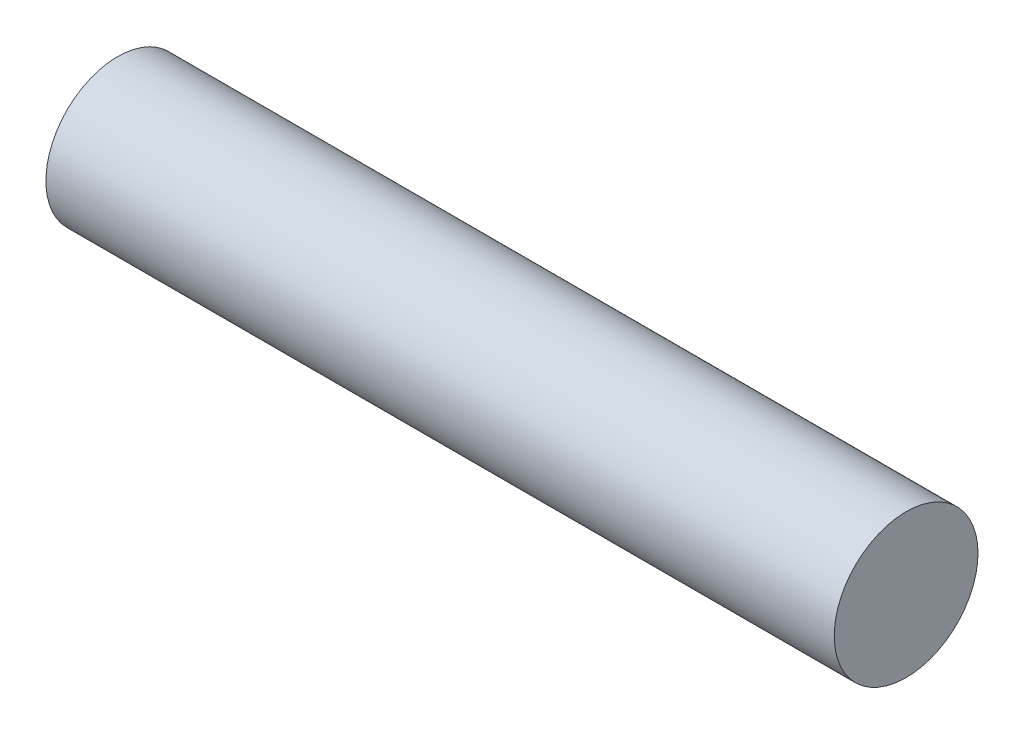
ISO-10303-21;
HEADER;
FILE_DESCRIPTION(('STEP AP214'),'2;1');
FILE_NAME('part.step','',(''),(''),'','','');
FILE_SCHEMA(('AUTOMOTIVE_DESIGN { 1 0 10303 214 1 1 1 1 }'));
ENDSEC;
DATA;
#1=APPLICATION_CONTEXT('core data for automotive mechanical design processes');
#2=APPLICATION_PROTOCOL_DEFINITION('international standard','automotive_design',2000,#1);
#3=PRODUCT_CONTEXT('',#1,'mechanical');
#4=PRODUCT('Part','Part','',(#3));
#5=PRODUCT_RELATED_PRODUCT_CATEGORY('part','',(#4));
#6=PRODUCT_DEFINITION_FORMATION('','',#4);
#7=PRODUCT_DEFINITION_CONTEXT('part definition',#1,'design');
#8=PRODUCT_DEFINITION('design','',#6,#7);
#9=PRODUCT_DEFINITION_SHAPE('','',#8);
#10=(LENGTH_UNIT() NAMED_UNIT(*) SI_UNIT(.MILLI.,.METRE.));
#11=(NAMED_UNIT(*) PLANE_ANGLE_UNIT() SI_UNIT($,.RADIAN.));
#12=(NAMED_UNIT(*) SI_UNIT($,.STERADIAN.) SOLID_ANGLE_UNIT());
#13=UNCERTAINTY_MEASURE_WITH_UNIT(LENGTH_MEASURE(1.E-05),#10,'distance_accuracy_value','');
#14=(GEOMETRIC_REPRESENTATION_CONTEXT(3) GLOBAL_UNCERTAINTY_ASSIGNED_CONTEXT((#13)) GLOBAL_UNIT_ASSIGNED_CONTEXT((#10,
#11,#12)) REPRESENTATION_CONTEXT('',''));
#15=CARTESIAN_POINT('',(0.,0.,0.));
#16=DIRECTION('',(0.,0.,1.));
#17=DIRECTION('',(1.,0.,0.));
#18=AXIS2_PLACEMENT_3D('',#15,#16,#17);
#19=CARTESIAN_POINT('',(207.25,0.,0.));
#20=DIRECTION('',(-1.,0.,0.));
#21=DIRECTION('',(0.,0.,1.));
#22=AXIS2_PLACEMENT_3D('',#19,#20,#21);
#23=CYLINDRICAL_SURFACE('',#22,37.8);
#24=CARTESIAN_POINT('',(207.25,0.,0.));
#25=DIRECTION('',(1.,0.,0.));
#26=DIRECTION('',(0.,0.,-1.));
#27=AXIS2_PLACEMENT_3D('',#24,#25,#26);
#28=CIRCLE('',#27,37.8);
#29=CARTESIAN_POINT('',(207.25,0.,-37.8));
#30=VERTEX_POINT('',#29);
#31=EDGE_CURVE('E10',#30,#30,#28,.T.);
#32=ORIENTED_EDGE('',*,*,#31,.F.);
#33=EDGE_LOOP('',(#32));
#34=FACE_BOUND('',#33,.T.);
#35=CARTESIAN_POINT('',(-207.25,0.,0.));
#36=DIRECTION('',(1.,0.,0.));
#37=DIRECTION('',(0.,0.,-1.));
#38=AXIS2_PLACEMENT_3D('',#35,#36,#37);
#39=CIRCLE('',#38,37.8);
#40=CARTESIAN_POINT('',(-207.25,0.,-37.8));
#41=VERTEX_POINT('',#40);
#42=EDGE_CURVE('E38',#41,#41,#39,.T.);
#43=ORIENTED_EDGE('',*,*,#42,.T.);
#44=EDGE_LOOP('',(#43));
#45=FACE_BOUND('',#44,.T.);
#46=ADVANCED_FACE('F35',(#34,#45),#23,.T.);
#47=CARTESIAN_POINT('',(207.25,0.,0.));
#48=DIRECTION('',(1.,0.,0.));
#49=DIRECTION('',(0.,0.,-1.));
#50=AXIS2_PLACEMENT_3D('',#47,#48,#49);
#51=PLANE('',#50);
#52=ORIENTED_EDGE('',*,*,#31,.T.);
#53=EDGE_LOOP('',(#52));
#54=FACE_BOUND('',#53,.T.);
#55=ADVANCED_FACE('F50',(#54),#51,.T.);
#56=CARTESIAN_POINT('',(-207.25,0.,0.));
#57=DIRECTION('',(1.,0.,0.));
#58=DIRECTION('',(0.,0.,-1.));
#59=AXIS2_PLACEMENT_3D('',#56,#57,#58);
#60=PLANE('',#59);
#61=ORIENTED_EDGE('',*,*,#42,.F.);
#62=EDGE_LOOP('',(#61));
#63=FACE_BOUND('',#62,.T.);
#64=ADVANCED_FACE('F48',(#63),#60,.F.);
#65=CLOSED_SHELL('',(#46,#55,#64));
#66=MANIFOLD_SOLID_BREP('B2',#65);
#67=ADVANCED_BREP_SHAPE_REPRESENTATION('',(#18,#66),#14);
#68=SHAPE_DEFINITION_REPRESENTATION(#9,#67);
ENDSEC;
END-ISO-10303-21;
